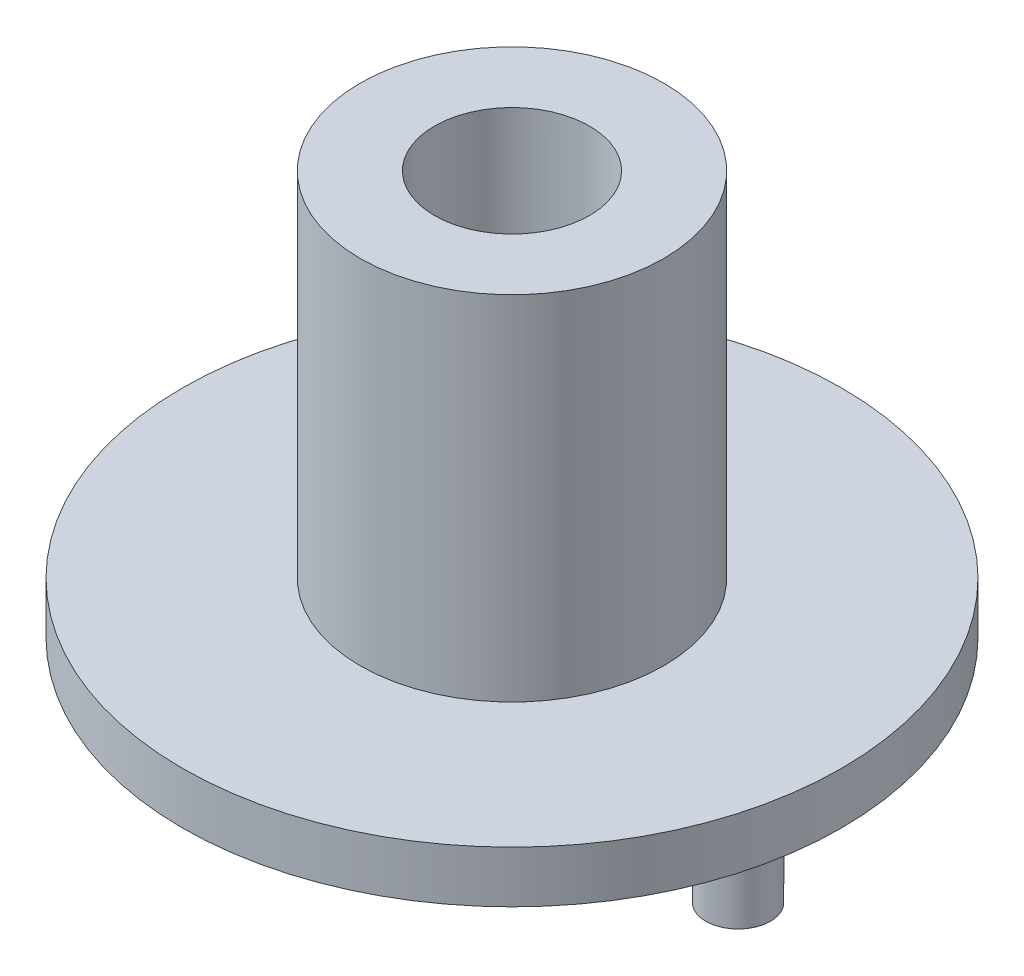
ISO-10303-21;
HEADER;
FILE_DESCRIPTION(('STEP AP214'),'2;1');
FILE_NAME('part.step','',(''),(''),'','','');
FILE_SCHEMA(('AUTOMOTIVE_DESIGN { 1 0 10303 214 1 1 1 1 }'));
ENDSEC;
DATA;
#1=APPLICATION_CONTEXT('core data for automotive mechanical design processes');
#2=APPLICATION_PROTOCOL_DEFINITION('international standard','automotive_design',2000,#1);
#3=PRODUCT_CONTEXT('',#1,'mechanical');
#4=PRODUCT('Part','Part','',(#3));
#5=PRODUCT_RELATED_PRODUCT_CATEGORY('part','',(#4));
#6=PRODUCT_DEFINITION_FORMATION('','',#4);
#7=PRODUCT_DEFINITION_CONTEXT('part definition',#1,'design');
#8=PRODUCT_DEFINITION('design','',#6,#7);
#9=PRODUCT_DEFINITION_SHAPE('','',#8);
#10=(LENGTH_UNIT() NAMED_UNIT(*) SI_UNIT(.MILLI.,.METRE.));
#11=(NAMED_UNIT(*) PLANE_ANGLE_UNIT() SI_UNIT($,.RADIAN.));
#12=(NAMED_UNIT(*) SI_UNIT($,.STERADIAN.) SOLID_ANGLE_UNIT());
#13=UNCERTAINTY_MEASURE_WITH_UNIT(LENGTH_MEASURE(1.E-05),#10,'distance_accuracy_value','');
#14=(GEOMETRIC_REPRESENTATION_CONTEXT(3) GLOBAL_UNCERTAINTY_ASSIGNED_CONTEXT((#13)) GLOBAL_UNIT_ASSIGNED_CONTEXT((#10,
#11,#12)) REPRESENTATION_CONTEXT('',''));
#15=CARTESIAN_POINT('',(0.,0.,0.));
#16=DIRECTION('',(0.,0.,1.));
#17=DIRECTION('',(1.,0.,0.));
#18=AXIS2_PLACEMENT_3D('',#15,#16,#17);
#19=CARTESIAN_POINT('',(0.,4.,0.));
#20=DIRECTION('',(0.,1.,0.));
#21=DIRECTION('',(0.,0.,1.));
#22=AXIS2_PLACEMENT_3D('',#19,#20,#21);
#23=PLANE('',#22);
#24=CARTESIAN_POINT('',(0.,4.,0.));
#25=DIRECTION('',(0.,1.,0.));
#26=DIRECTION('',(0.,0.,1.));
#27=AXIS2_PLACEMENT_3D('',#24,#25,#26);
#28=CIRCLE('',#27,25.5);
#29=CARTESIAN_POINT('',(0.,4.,25.5));
#30=VERTEX_POINT('',#29);
#31=EDGE_CURVE('E45',#30,#30,#28,.T.);
#32=ORIENTED_EDGE('',*,*,#31,.T.);
#33=EDGE_LOOP('',(#32));
#34=FACE_BOUND('',#33,.T.);
#35=CARTESIAN_POINT('',(0.,4.,0.));
#36=DIRECTION('',(0.,1.,0.));
#37=DIRECTION('',(0.,0.,1.));
#38=AXIS2_PLACEMENT_3D('',#35,#36,#37);
#39=CIRCLE('',#38,11.75);
#40=CARTESIAN_POINT('',(0.,4.,11.75));
#41=VERTEX_POINT('',#40);
#42=EDGE_CURVE('E58',#41,#41,#39,.T.);
#43=ORIENTED_EDGE('',*,*,#42,.F.);
#44=EDGE_LOOP('',(#43));
#45=FACE_BOUND('',#44,.T.);
#46=ADVANCED_FACE('F34',(#34,#45),#23,.T.);
#47=CARTESIAN_POINT('',(0.,0.,0.));
#48=DIRECTION('',(0.,1.,0.));
#49=DIRECTION('',(0.,0.,1.));
#50=AXIS2_PLACEMENT_3D('',#47,#48,#49);
#51=PLANE('',#50);
#52=CARTESIAN_POINT('',(17.5,0.,0.));
#53=DIRECTION('',(0.,1.,0.));
#54=DIRECTION('',(0.,0.,1.));
#55=AXIS2_PLACEMENT_3D('',#52,#53,#54);
#56=CIRCLE('',#55,2.5);
#57=CARTESIAN_POINT('',(17.5,0.,2.50000000000001));
#58=VERTEX_POINT('',#57);
#59=EDGE_CURVE('E10',#58,#58,#56,.F.);
#60=ORIENTED_EDGE('',*,*,#59,.F.);
#61=EDGE_LOOP('',(#60));
#62=FACE_BOUND('',#61,.T.);
#63=CARTESIAN_POINT('',(-17.5,2.22044604925031E-13,0.));
#64=DIRECTION('',(0.,1.,0.));
#65=DIRECTION('',(0.,0.,1.));
#66=AXIS2_PLACEMENT_3D('',#63,#64,#65);
#67=CIRCLE('',#66,2.5);
#68=CARTESIAN_POINT('',(-17.5,2.22044604925031E-13,2.5));
#69=VERTEX_POINT('',#68);
#70=EDGE_CURVE('E41',#69,#69,#67,.F.);
#71=ORIENTED_EDGE('',*,*,#70,.F.);
#72=EDGE_LOOP('',(#71));
#73=FACE_BOUND('',#72,.T.);
#74=CARTESIAN_POINT('',(0.,0.,0.));
#75=DIRECTION('',(0.,1.,0.));
#76=DIRECTION('',(0.,0.,1.));
#77=AXIS2_PLACEMENT_3D('',#74,#75,#76);
#78=CIRCLE('',#77,25.5);
#79=CARTESIAN_POINT('',(0.,0.,25.5));
#80=VERTEX_POINT('',#79);
#81=EDGE_CURVE('E49',#80,#80,#78,.T.);
#82=ORIENTED_EDGE('',*,*,#81,.F.);
#83=EDGE_LOOP('',(#82));
#84=FACE_BOUND('',#83,.T.);
#85=CARTESIAN_POINT('',(0.,0.,0.));
#86=DIRECTION('',(0.,1.,0.));
#87=DIRECTION('',(0.,0.,1.));
#88=AXIS2_PLACEMENT_3D('',#85,#86,#87);
#89=CIRCLE('',#88,6.);
#90=CARTESIAN_POINT('',(0.,0.,6.));
#91=VERTEX_POINT('',#90);
#92=EDGE_CURVE('E53',#91,#91,#89,.T.);
#93=ORIENTED_EDGE('',*,*,#92,.T.);
#94=EDGE_LOOP('',(#93));
#95=FACE_BOUND('',#94,.T.);
#96=ADVANCED_FACE('F120',(#62,#73,#84,#95),#51,.F.);
#97=CARTESIAN_POINT('',(0.,4.,0.));
#98=DIRECTION('',(0.,-1.,0.));
#99=DIRECTION('',(0.,0.,-1.));
#100=AXIS2_PLACEMENT_3D('',#97,#98,#99);
#101=CYLINDRICAL_SURFACE('',#100,25.5);
#102=ORIENTED_EDGE('',*,*,#31,.F.);
#103=EDGE_LOOP('',(#102));
#104=FACE_BOUND('',#103,.T.);
#105=ORIENTED_EDGE('',*,*,#81,.T.);
#106=EDGE_LOOP('',(#105));
#107=FACE_BOUND('',#106,.T.);
#108=ADVANCED_FACE('F36',(#104,#107),#101,.T.);
#109=CARTESIAN_POINT('',(0.,4.,0.));
#110=DIRECTION('',(0.,-1.,0.));
#111=DIRECTION('',(0.,0.,-1.));
#112=AXIS2_PLACEMENT_3D('',#109,#110,#111);
#113=CYLINDRICAL_SURFACE('',#112,6.);
#114=CARTESIAN_POINT('',(2.99999999999998,21.3,-5.19615242270664));
#115=CARTESIAN_POINT('',(2.99999910875736,21.2217997667409,-5.19615338151414));
#116=CARTESIAN_POINT('',(2.99693611207794,21.1435900015354,-5.1979258119113));
#117=CARTESIAN_POINT('',(2.98473565374509,20.9877919248579,-5.20493931657128));
#118=CARTESIAN_POINT('',(2.97559536411628,20.9102039197315,-5.21018200566087));
#119=CARTESIAN_POINT('',(2.93916912258039,20.6790559857536,-5.2308820055821));
#120=CARTESIAN_POINT('',(2.90287805814898,20.5272490894668,-5.25131076607216));
#121=CARTESIAN_POINT('',(2.80829998089522,20.2336083664765,-5.30247746927541));
#122=CARTESIAN_POINT('',(2.7501298934662,20.0917261982491,-5.33316051577921));
#123=CARTESIAN_POINT('',(2.61380253964663,19.8197372382992,-5.40128072966975));
#124=CARTESIAN_POINT('',(2.53564419197535,19.6896310841251,-5.43871826241349));
#125=CARTESIAN_POINT('',(2.35399963256533,19.4330798538523,-5.5199058355984));
#126=CARTESIAN_POINT('',(2.24895611137363,19.3078217978441,-5.56392184571634));
#127=CARTESIAN_POINT('',(2.01976141989963,19.0757756303104,-5.65115954702503));
#128=CARTESIAN_POINT('',(1.89560077655244,18.9689967317433,-5.69438083245623));
#129=CARTESIAN_POINT('',(1.6214686910916,18.7698983122677,-5.7786442898889));
#130=CARTESIAN_POINT('',(1.47032156718994,18.6790386340728,-5.81934318752249));
#131=CARTESIAN_POINT('',(1.15247107964641,18.5245775025719,-5.89052268800543));
#132=CARTESIAN_POINT('',(0.985777614653093,18.4609588467535,-5.9210097369081));
#133=CARTESIAN_POINT('',(0.654134831556283,18.3674860020109,-5.96641383603058));
#134=CARTESIAN_POINT('',(0.489905370480172,18.3355514203519,-5.98228440595575));
#135=CARTESIAN_POINT('',(0.157711887079238,18.299501644556,-6.00022751605267));
#136=CARTESIAN_POINT('',(-0.0102498138110355,18.2953696178678,-6.00230840492441));
#137=CARTESIAN_POINT('',(-0.329497576667932,18.3142400326349,-5.99288945622742));
#138=CARTESIAN_POINT('',(-0.480963609704611,18.334914088078,-5.98255487247968));
#139=CARTESIAN_POINT('',(-0.777941303579865,18.3986424901965,-5.95122736207792));
#140=CARTESIAN_POINT('',(-0.923452517976647,18.4416985115779,-5.93023363786808));
#141=CARTESIAN_POINT('',(-1.20692822064064,18.5492478557696,-5.87914748253372));
#142=CARTESIAN_POINT('',(-1.34476044303004,18.6140295312006,-5.84893318545181));
#143=CARTESIAN_POINT('',(-1.60793023199371,18.7627896567079,-5.78212944004647));
#144=CARTESIAN_POINT('',(-1.73326330217193,18.8467749795097,-5.74553771044375));
#145=CARTESIAN_POINT('',(-1.98052168794678,19.0406884739395,-5.66533158492103));
#146=CARTESIAN_POINT('',(-2.10100497271935,19.1523185106416,-5.62138031742826));
#147=CARTESIAN_POINT('',(-2.32231036115799,19.3937597419088,-5.53363118085846));
#148=CARTESIAN_POINT('',(-2.42311733790259,19.5235847938957,-5.48983345502615));
#149=CARTESIAN_POINT('',(-2.6085269546345,19.8079821433407,-5.40432084665527));
#150=CARTESIAN_POINT('',(-2.69169402852801,19.963602435646,-5.36291485750668));
#151=CARTESIAN_POINT('',(-2.79542837524199,20.2075630546118,-5.30915194408668));
#152=CARTESIAN_POINT('',(-2.82650797342003,20.2906563104048,-5.29261946495431));
#153=CARTESIAN_POINT('',(-2.88131297532034,20.4598086030344,-5.2629847346327));
#154=CARTESIAN_POINT('',(-2.90504291399186,20.5458657744748,-5.24988036897854));
#155=CARTESIAN_POINT('',(-2.94323927983804,20.713371620224,-5.22855455988393));
#156=CARTESIAN_POINT('',(-2.95828810706487,20.7946494256379,-5.22002982263215));
#157=CARTESIAN_POINT('',(-2.98163903200843,20.9584352386659,-5.20672737157292));
#158=CARTESIAN_POINT('',(-2.98994463830256,21.0409425837483,-5.2019477092041));
#159=CARTESIAN_POINT('',(-2.99968663811346,21.2064710068027,-5.19633662863609));
#160=CARTESIAN_POINT('',(-3.00112558946314,21.2894918819437,-5.19550374026214));
#161=CARTESIAN_POINT('',(-2.99712742537403,21.4552864607647,-5.19780953199968));
#162=CARTESIAN_POINT('',(-2.99169077406598,21.5380601807505,-5.2009479440325));
#163=CARTESIAN_POINT('',(-2.96710135231214,21.7668591360427,-5.21504493010248));
#164=CARTESIAN_POINT('',(-2.9405616310018,21.9119108102633,-5.230191606605));
#165=CARTESIAN_POINT('',(-2.86709067362229,22.1951309107969,-5.27081666384499));
#166=CARTESIAN_POINT('',(-2.82015283383764,22.3332970918302,-5.29629839028766));
#167=CARTESIAN_POINT('',(-2.70494224478443,22.6062261039199,-5.35608780273033));
#168=CARTESIAN_POINT('',(-2.63578205088437,22.7405349279041,-5.39074960412732));
#169=CARTESIAN_POINT('',(-2.47886133231339,22.996409938366,-5.46468327792418));
#170=CARTESIAN_POINT('',(-2.39109125263822,23.1179695308114,-5.50395751387986));
#171=CARTESIAN_POINT('',(-2.186511456958,23.3609356266318,-5.58864005140302));
#172=CARTESIAN_POINT('',(-2.067435804994,23.4803912709,-5.6341975208474));
#173=CARTESIAN_POINT('',(-1.8102134981498,23.6982368952949,-5.72202702310925));
#174=CARTESIAN_POINT('',(-1.67206042712516,23.7966197596756,-5.76429794308225));
#175=CARTESIAN_POINT('',(-1.37560608443381,23.9717211275737,-5.84224085806642));
#176=CARTESIAN_POINT('',(-1.21686929217556,24.0477993418831,-5.87770925226885));
#177=CARTESIAN_POINT('',(-0.886567094469554,24.1714137243106,-5.93650064667296));
#178=CARTESIAN_POINT('',(-0.71501310312402,24.218974954842,-5.95983430919532));
#179=CARTESIAN_POINT('',(-0.380939047947213,24.2801056918491,-5.9900252464518));
#180=CARTESIAN_POINT('',(-0.219034335650403,24.2963936355608,-5.99819783930704));
#181=CARTESIAN_POINT('',(0.105377961951194,24.3025297884335,-6.0012639091934));
#182=CARTESIAN_POINT('',(0.267885316317459,24.2923872531832,-5.99616203476053));
#183=CARTESIAN_POINT('',(0.577613962536137,24.2477508098665,-5.97401907190636));
#184=CARTESIAN_POINT('',(0.725136901247714,24.2149055623343,-5.95778686442447));
#185=CARTESIAN_POINT('',(1.0123379087444,24.1280188919679,-5.9157627855145));
#186=CARTESIAN_POINT('',(1.15201484923627,24.0739744294575,-5.88996954319456));
#187=CARTESIAN_POINT('',(1.42627001605164,23.9438192713113,-5.82977801711599));
#188=CARTESIAN_POINT('',(1.56037465678412,23.8668636584637,-5.79505887623291));
#189=CARTESIAN_POINT('',(1.81432469711302,23.6941245785864,-5.72064363382013));
#190=CARTESIAN_POINT('',(1.9341635067691,23.5983324640112,-5.6809452494399));
#191=CARTESIAN_POINT('',(2.16873884087779,23.3796152775164,-5.59585978819438));
#192=CARTESIAN_POINT('',(2.28178066887875,23.2549386792264,-5.55029975504521));
#193=CARTESIAN_POINT('',(2.48600225783029,22.9876216719298,-5.4618864950968));
#194=CARTESIAN_POINT('',(2.57716267726703,22.8449655389689,-5.41903568750869));
#195=CARTESIAN_POINT('',(2.69665559342488,22.6174682066982,-5.36004774906988));
#196=CARTESIAN_POINT('',(2.73405408762355,22.5380241990176,-5.34101219148466));
#197=CARTESIAN_POINT('',(2.80191257626506,22.3756467169913,-5.30572783063723));
#198=CARTESIAN_POINT('',(2.83237614466584,22.292715066252,-5.28947759301447));
#199=CARTESIAN_POINT('',(2.88592624586958,22.1241552676302,-5.26045215868189));
#200=CARTESIAN_POINT('',(2.90903175649394,22.0385346927586,-5.24766803509096));
#201=CARTESIAN_POINT('',(2.9476242805163,21.8651447446857,-5.22608869625115));
#202=CARTESIAN_POINT('',(2.9631166204962,21.7773769190793,-5.21729069243664));
#203=CARTESIAN_POINT('',(2.9830938122572,21.62460118224,-5.20588528016134));
#204=CARTESIAN_POINT('',(2.9894274622838,21.559905191093,-5.20224442588142));
#205=CARTESIAN_POINT('',(2.99788106792141,21.4301416832003,-5.1973775174469));
#206=CARTESIAN_POINT('',(3.00000074164546,21.3650741418924,-5.19615162483721));
#207=CARTESIAN_POINT('',(2.99999999999998,21.3,-5.19615242270664));
#208=B_SPLINE_CURVE_WITH_KNOTS('',3,(#114,#115,#116,#117,#118,#119,#120,#121,#122,#123,#124,
#125,#126,#127,#128,#129,#130,#131,#132,#133,#134,#135,#136,#137,#138,#139,#140,#141,#142,#143,
#144,#145,#146,#147,#148,#149,#150,#151,#152,#153,#154,#155,#156,#157,#158,#159,#160,#161,#162,
#163,#164,#165,#166,#167,#168,#169,#170,#171,#172,#173,#174,#175,#176,#177,#178,#179,#180,#181,
#182,#183,#184,#185,#186,#187,#188,#189,#190,#191,#192,#193,#194,#195,#196,#197,#198,#199,#200,
#201,#202,#203,#204,#205,#206,#207),.UNSPECIFIED.,.T.,.F.,(4,2,2,2,2,2,2,2,2,2,2,2,2,2,2,2,2,2,
2,2,2,2,2,2,2,2,2,2,2,2,2,2,2,2,2,2,2,2,2,2,2,2,2,2,2,2,4),(0.,0.23452943073388,
0.469168072604243,0.938850383294481,1.40605749261236,1.87328988121651,2.37905864237579,
2.88507883741224,3.42520847204398,3.9649965137978,4.46637625391913,4.96745241546229,
5.42495462941725,5.88249108040476,6.3463577468155,6.81039068538925,7.3182874485878,
7.82657315225863,8.36713695676454,8.63752916119811,8.90775419202326,9.15669600787592,
9.40550821320572,9.65422772860785,9.90293045534217,10.3454331624117,10.7880792327729,
11.2512265518736,11.7146122462923,12.2364099671094,12.7583836090371,13.2941331020799,
13.8294110539541,14.3155757713756,14.8015702635101,15.2555404058357,15.7095756650514,
16.1830301812751,16.6567025627126,17.177514915193,17.6987859450456,17.9680115893229,
18.2370981707631,18.5054849980179,18.7736837791728,18.9688338446807,19.1639969639894),.UNSPECIFIED.);
#209=CARTESIAN_POINT('',(2.99999999999998,21.3,-5.19615242270664));
#210=VERTEX_POINT('',#209);
#211=EDGE_CURVE('E73',#210,#210,#208,.T.);
#212=ORIENTED_EDGE('',*,*,#211,.T.);
#213=EDGE_LOOP('',(#212));
#214=FACE_BOUND('',#213,.T.);
#215=ORIENTED_EDGE('',*,*,#92,.F.);
#216=EDGE_LOOP('',(#215));
#217=FACE_BOUND('',#216,.T.);
#218=CARTESIAN_POINT('',(0.,31.3,0.));
#219=DIRECTION('',(0.,1.,0.));
#220=DIRECTION('',(0.,0.,1.));
#221=AXIS2_PLACEMENT_3D('',#218,#219,#220);
#222=CIRCLE('',#221,6.);
#223=CARTESIAN_POINT('',(0.,31.3,5.99999999999999));
#224=VERTEX_POINT('',#223);
#225=EDGE_CURVE('E61',#224,#224,#222,.T.);
#226=ORIENTED_EDGE('',*,*,#225,.T.);
#227=EDGE_LOOP('',(#226));
#228=FACE_BOUND('',#227,.T.);
#229=ADVANCED_FACE('F111',(#214,#217,#228),#113,.F.);
#230=CARTESIAN_POINT('',(0.,31.3,0.));
#231=DIRECTION('',(0.,1.,0.));
#232=DIRECTION('',(0.,0.,1.));
#233=AXIS2_PLACEMENT_3D('',#230,#231,#232);
#234=PLANE('',#233);
#235=CARTESIAN_POINT('',(0.,31.3,0.));
#236=DIRECTION('',(0.,1.,0.));
#237=DIRECTION('',(0.,0.,1.));
#238=AXIS2_PLACEMENT_3D('',#235,#236,#237);
#239=CIRCLE('',#238,11.75);
#240=CARTESIAN_POINT('',(0.,31.3,11.75));
#241=VERTEX_POINT('',#240);
#242=EDGE_CURVE('E57',#241,#241,#239,.T.);
#243=ORIENTED_EDGE('',*,*,#242,.T.);
#244=EDGE_LOOP('',(#243));
#245=FACE_BOUND('',#244,.T.);
#246=ORIENTED_EDGE('',*,*,#225,.F.);
#247=EDGE_LOOP('',(#246));
#248=FACE_BOUND('',#247,.T.);
#249=ADVANCED_FACE('F108',(#245,#248),#234,.T.);
#250=CARTESIAN_POINT('',(0.,31.3,0.));
#251=DIRECTION('',(0.,-1.,0.));
#252=DIRECTION('',(0.,0.,-1.));
#253=AXIS2_PLACEMENT_3D('',#250,#251,#252);
#254=CYLINDRICAL_SURFACE('',#253,11.75);
#255=CARTESIAN_POINT('',(2.99999999999998,21.3,-11.3605677675018));
#256=CARTESIAN_POINT('',(2.99999550888597,21.1344628977713,-11.3605708516814));
#257=CARTESIAN_POINT('',(2.98625206017291,20.9688767988764,-11.3642254027522));
#258=CARTESIAN_POINT('',(2.93173418631671,20.6424681467262,-11.3784094216479));
#259=CARTESIAN_POINT('',(2.89094471288954,20.4816482974601,-11.3889427167252));
#260=CARTESIAN_POINT('',(2.78374789339068,20.1695408164099,-11.4156152463244));
#261=CARTESIAN_POINT('',(2.71737453614942,20.0182408461437,-11.4317470402791));
#262=CARTESIAN_POINT('',(2.56099851945713,19.7289048135482,-11.4677895901246));
#263=CARTESIAN_POINT('',(2.47099459342157,19.5908694627365,-11.4877005485604));
#264=CARTESIAN_POINT('',(2.26770577354923,19.3288139358595,-11.5295695371698));
#265=CARTESIAN_POINT('',(2.15397750993709,19.205143040378,-11.5515614113026));
#266=CARTESIAN_POINT('',(1.90742287905683,18.9784073809511,-11.5948211760719));
#267=CARTESIAN_POINT('',(1.77459466913653,18.8753446074539,-11.6160889966108));
#268=CARTESIAN_POINT('',(1.49120870077665,18.6913131531067,-11.6558798005083));
#269=CARTESIAN_POINT('',(1.34042047521559,18.610688886877,-11.6743581929566));
#270=CARTESIAN_POINT('',(1.02688025193712,18.4760645858107,-11.7061013253124));
#271=CARTESIAN_POINT('',(0.864130102251212,18.4220604482487,-11.7193668685663));
#272=CARTESIAN_POINT('',(0.534928620503665,18.3433317919636,-11.738950364584));
#273=CARTESIAN_POINT('',(0.36862772428859,18.3180138156607,-11.745408934771));
#274=CARTESIAN_POINT('',(0.0340219613360346,18.2955119938449,-11.7511413064087));
#275=CARTESIAN_POINT('',(-0.134282592906946,18.2983238171104,-11.7504162139475));
#276=CARTESIAN_POINT('',(-0.463997556401781,18.3315777345096,-11.7419671196665));
#277=CARTESIAN_POINT('',(-0.625477379264435,18.3613790636267,-11.7344054342502));
#278=CARTESIAN_POINT('',(-0.941063721008122,18.4467344577078,-11.713322579056));
#279=CARTESIAN_POINT('',(-1.09516983766307,18.5022899257638,-11.6998010845882));
#280=CARTESIAN_POINT('',(-1.39330598937894,18.6380864195144,-11.6680719554114));
#281=CARTESIAN_POINT('',(-1.53722866114644,18.7185528134537,-11.6498217970373));
#282=CARTESIAN_POINT('',(-1.80975082996784,18.9017154377632,-11.6106108795236));
#283=CARTESIAN_POINT('',(-1.93834755287723,19.004415683228,-11.589649631078));
#284=CARTESIAN_POINT('',(-2.18039001517402,19.2325553241237,-11.5465992825672));
#285=CARTESIAN_POINT('',(-2.293306167165,19.3585543409552,-11.524495046466));
#286=CARTESIAN_POINT('',(-2.49652766827807,19.6279304966444,-11.4821885876333));
#287=CARTESIAN_POINT('',(-2.58683186505274,19.7713085206164,-11.4619864618695));
#288=CARTESIAN_POINT('',(-2.74262491097856,20.0724456315498,-11.4257152787676));
#289=CARTESIAN_POINT('',(-2.80798115443734,20.2302761853208,-11.4096684492186));
#290=CARTESIAN_POINT('',(-2.91106448139263,20.5551943930271,-11.3838068691383));
#291=CARTESIAN_POINT('',(-2.94879776734017,20.7222799597753,-11.3739907196378));
#292=CARTESIAN_POINT('',(-2.99467472732696,21.0560409137308,-11.3619969404693));
#293=CARTESIAN_POINT('',(-3.00360360508616,21.2226012143776,-11.3596166684701));
#294=CARTESIAN_POINT('',(-2.99377224649343,21.5548329872141,-11.3622116667414));
#295=CARTESIAN_POINT('',(-2.97501468168589,21.720504543613,-11.3671862273231));
#296=CARTESIAN_POINT('',(-2.91103257024377,22.0433062603578,-11.3837357080519));
#297=CARTESIAN_POINT('',(-2.86626980098417,22.2005344246364,-11.3951953815693));
#298=CARTESIAN_POINT('',(-2.75206217180208,22.5052542270666,-11.4233134626099));
#299=CARTESIAN_POINT('',(-2.68261429232108,22.652744671452,-11.4399725061056));
#300=CARTESIAN_POINT('',(-2.51937983545073,22.9371162078244,-11.4770355638553));
#301=CARTESIAN_POINT('',(-2.42512641839131,23.0737200831898,-11.4975089331603));
#302=CARTESIAN_POINT('',(-2.21554303117295,23.3294610935214,-11.5397258630823));
#303=CARTESIAN_POINT('',(-2.10020944172577,23.4485952227391,-11.561469641381));
#304=CARTESIAN_POINT('',(-1.84812712719636,23.6692202612714,-11.6044675860038));
#305=CARTESIAN_POINT('',(-1.71089615270232,23.7701666075196,-11.6256939623879));
#306=CARTESIAN_POINT('',(-1.42097665018049,23.9475841432736,-11.6646768538086));
#307=CARTESIAN_POINT('',(-1.268288936833,24.0240566218435,-11.6824335515778));
#308=CARTESIAN_POINT('',(-0.952854728546915,24.1496784374519,-11.7123633609101));
#309=CARTESIAN_POINT('',(-0.790191653495437,24.1990271032213,-11.7245770878468));
#310=CARTESIAN_POINT('',(-0.45852656766608,24.2695930761257,-11.7422229245123));
#311=CARTESIAN_POINT('',(-0.28952584361649,24.2908160621399,-11.7476564032336));
#312=CARTESIAN_POINT('',(0.0449103655036465,24.304197345404,-11.751070910074));
#313=CARTESIAN_POINT('',(0.210312133234402,24.297157739566,-11.7492576097181));
#314=CARTESIAN_POINT('',(0.537493776880597,24.2560587289413,-11.7388412133363));
#315=CARTESIAN_POINT('',(0.699273768924194,24.2220001917657,-11.7302383353321));
#316=CARTESIAN_POINT('',(1.01374063902866,24.1282678429452,-11.7072440848788));
#317=CARTESIAN_POINT('',(1.16647506277408,24.068744639867,-11.6928867775409));
#318=CARTESIAN_POINT('',(1.45987578289461,23.9259083830693,-11.6598920988169));
#319=CARTESIAN_POINT('',(1.60054049872864,23.8425922198007,-11.6412541680501));
#320=CARTESIAN_POINT('',(1.86959078565116,23.6521197424981,-11.6011252496874));
#321=CARTESIAN_POINT('',(1.99758494686037,23.5444230541817,-11.5795749320429));
#322=CARTESIAN_POINT('',(2.23395622531062,23.309288185583,-11.5363083373686));
#323=CARTESIAN_POINT('',(2.34232830518666,23.181844951522,-11.5145920192103));
#324=CARTESIAN_POINT('',(2.53847877609961,22.9078159161499,-11.4729638984495));
#325=CARTESIAN_POINT('',(2.62580990953268,22.7609027475943,-11.4530960196066));
#326=CARTESIAN_POINT('',(2.7744053488803,22.4539921285069,-11.4180140343661));
#327=CARTESIAN_POINT('',(2.83568803037713,22.2940039968672,-11.4027966494676));
#328=CARTESIAN_POINT('',(2.92166504754804,21.9953251475538,-11.381034699892));
#329=CARTESIAN_POINT('',(2.95097510853071,21.8580233007285,-11.3734186901498));
#330=CARTESIAN_POINT('',(2.99014357679765,21.5804925116178,-11.3631841512714));
#331=CARTESIAN_POINT('',(3.0000038054364,21.4402638446537,-11.360565154197));
#332=CARTESIAN_POINT('',(2.99999999999998,21.3,-11.3605677675018));
#333=B_SPLINE_CURVE_WITH_KNOTS('',3,(#255,#256,#257,#258,#259,#260,#261,#262,#263,#264,#265,
#266,#267,#268,#269,#270,#271,#272,#273,#274,#275,#276,#277,#278,#279,#280,#281,#282,#283,#284,
#285,#286,#287,#288,#289,#290,#291,#292,#293,#294,#295,#296,#297,#298,#299,#300,#301,#302,#303,
#304,#305,#306,#307,#308,#309,#310,#311,#312,#313,#314,#315,#316,#317,#318,#319,#320,#321,#322,
#323,#324,#325,#326,#327,#328,#329,#330,#331,#332),.UNSPECIFIED.,.T.,.F.,(4,2,2,2,2,2,2,2,2,2,2,
2,2,2,2,2,2,2,2,2,2,2,2,2,2,2,2,2,2,2,2,2,2,2,2,2,2,2,4),(0.,0.496096005995656,
0.992468269413034,1.48818335015291,1.9839250063544,2.48992900980557,2.99598186238452,
3.50942050638832,4.02277999386604,4.52531328459487,5.02776920010088,5.51860018744603,
6.00945791853069,6.50489302830287,7.0004176808385,7.50991755301146,8.01944338496647,
8.53164098617161,9.04372354336719,9.54172336141581,10.0396751291723,10.5290438332359,
11.0184724189945,11.5178678636361,12.0173491309539,12.529927936701,13.0424797399446,
13.5512127241365,14.0598429739757,14.5541417130688,15.0484245802639,15.5398236139667,
16.0312868989996,16.5349479834251,17.0387381845579,17.5524429979425,18.0657848202793,
18.4861790958597,18.9065340022911),.UNSPECIFIED.);
#334=CARTESIAN_POINT('',(2.99999999999998,21.3,-11.3605677675018));
#335=VERTEX_POINT('',#334);
#336=EDGE_CURVE('E72',#335,#335,#333,.T.);
#337=ORIENTED_EDGE('',*,*,#336,.F.);
#338=EDGE_LOOP('',(#337));
#339=FACE_BOUND('',#338,.T.);
#340=ORIENTED_EDGE('',*,*,#242,.F.);
#341=EDGE_LOOP('',(#340));
#342=FACE_BOUND('',#341,.T.);
#343=ORIENTED_EDGE('',*,*,#42,.T.);
#344=EDGE_LOOP('',(#343));
#345=FACE_BOUND('',#344,.T.);
#346=ADVANCED_FACE('F106',(#339,#342,#345),#254,.T.);
#347=CARTESIAN_POINT('',(-17.5,-8.99999999999979,0.));
#348=DIRECTION('',(0.,1.,0.));
#349=DIRECTION('',(0.,0.,1.));
#350=AXIS2_PLACEMENT_3D('',#347,#348,#349);
#351=CYLINDRICAL_SURFACE('',#350,2.5);
#352=CARTESIAN_POINT('',(-17.5,-8.99999999999979,0.));
#353=DIRECTION('',(0.,-1.,0.));
#354=DIRECTION('',(0.,0.,-1.));
#355=AXIS2_PLACEMENT_3D('',#352,#353,#354);
#356=CIRCLE('',#355,2.5);
#357=CARTESIAN_POINT('',(-17.5,-8.99999999999979,-2.49999999999999));
#358=VERTEX_POINT('',#357);
#359=EDGE_CURVE('E66',#358,#358,#356,.T.);
#360=ORIENTED_EDGE('',*,*,#359,.F.);
#361=EDGE_LOOP('',(#360));
#362=FACE_BOUND('',#361,.T.);
#363=ORIENTED_EDGE('',*,*,#70,.T.);
#364=EDGE_LOOP('',(#363));
#365=FACE_BOUND('',#364,.T.);
#366=ADVANCED_FACE('F102',(#362,#365),#351,.T.);
#367=CARTESIAN_POINT('',(-17.5,-8.99999999999979,0.));
#368=DIRECTION('',(0.,-1.,0.));
#369=DIRECTION('',(0.,0.,-1.));
#370=AXIS2_PLACEMENT_3D('',#367,#368,#369);
#371=PLANE('',#370);
#372=ORIENTED_EDGE('',*,*,#359,.T.);
#373=EDGE_LOOP('',(#372));
#374=FACE_BOUND('',#373,.T.);
#375=ADVANCED_FACE('F98',(#374),#371,.T.);
#376=CARTESIAN_POINT('',(17.5,-9.00000000000001,0.));
#377=DIRECTION('',(0.,1.,0.));
#378=DIRECTION('',(0.,0.,1.));
#379=AXIS2_PLACEMENT_3D('',#376,#377,#378);
#380=CYLINDRICAL_SURFACE('',#379,2.5);
#381=CARTESIAN_POINT('',(17.5,-9.00000000000001,0.));
#382=DIRECTION('',(0.,-1.,0.));
#383=DIRECTION('',(0.,0.,-1.));
#384=AXIS2_PLACEMENT_3D('',#381,#382,#383);
#385=CIRCLE('',#384,2.5);
#386=CARTESIAN_POINT('',(17.5,-9.00000000000001,-2.5));
#387=VERTEX_POINT('',#386);
#388=EDGE_CURVE('E69',#387,#387,#385,.T.);
#389=ORIENTED_EDGE('',*,*,#388,.F.);
#390=EDGE_LOOP('',(#389));
#391=FACE_BOUND('',#390,.T.);
#392=ORIENTED_EDGE('',*,*,#59,.T.);
#393=EDGE_LOOP('',(#392));
#394=FACE_BOUND('',#393,.T.);
#395=ADVANCED_FACE('F94',(#391,#394),#380,.T.);
#396=CARTESIAN_POINT('',(17.5,-9.00000000000001,0.));
#397=DIRECTION('',(0.,-1.,0.));
#398=DIRECTION('',(0.,0.,-1.));
#399=AXIS2_PLACEMENT_3D('',#396,#397,#398);
#400=PLANE('',#399);
#401=ORIENTED_EDGE('',*,*,#388,.T.);
#402=EDGE_LOOP('',(#401));
#403=FACE_BOUND('',#402,.T.);
#404=ADVANCED_FACE('F89',(#403),#400,.T.);
#405=CARTESIAN_POINT('',(0.,21.3,-25.501));
#406=DIRECTION('',(0.,0.,1.));
#407=DIRECTION('',(1.,0.,0.));
#408=AXIS2_PLACEMENT_3D('',#405,#406,#407);
#409=CYLINDRICAL_SURFACE('',#408,3.);
#410=ORIENTED_EDGE('',*,*,#211,.F.);
#411=EDGE_LOOP('',(#410));
#412=FACE_BOUND('',#411,.T.);
#413=ORIENTED_EDGE('',*,*,#336,.T.);
#414=EDGE_LOOP('',(#413));
#415=FACE_BOUND('',#414,.T.);
#416=ADVANCED_FACE('F83',(#412,#415),#409,.F.);
#417=CLOSED_SHELL('',(#46,#96,#108,#229,#249,#346,#366,#375,#395,#404,#416));
#418=MANIFOLD_SOLID_BREP('B2',#417);
#419=ADVANCED_BREP_SHAPE_REPRESENTATION('',(#18,#418),#14);
#420=SHAPE_DEFINITION_REPRESENTATION(#9,#419);
ENDSEC;
END-ISO-10303-21;
